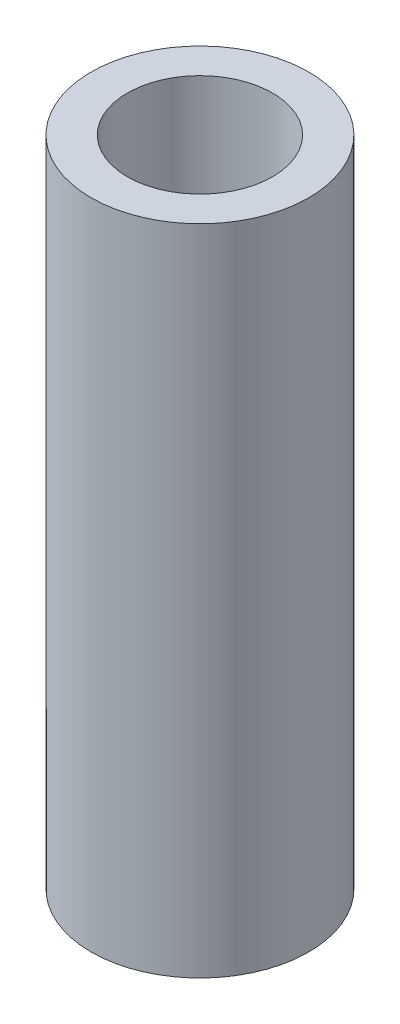
ISO-10303-21;
HEADER;
FILE_DESCRIPTION(('STEP AP214'),'2;1');
FILE_NAME('part.step','',(''),(''),'','','');
FILE_SCHEMA(('AUTOMOTIVE_DESIGN { 1 0 10303 214 1 1 1 1 }'));
ENDSEC;
DATA;
#1=APPLICATION_CONTEXT('core data for automotive mechanical design processes');
#2=APPLICATION_PROTOCOL_DEFINITION('international standard','automotive_design',2000,#1);
#3=PRODUCT_CONTEXT('',#1,'mechanical');
#4=PRODUCT('Part','Part','',(#3));
#5=PRODUCT_RELATED_PRODUCT_CATEGORY('part','',(#4));
#6=PRODUCT_DEFINITION_FORMATION('','',#4);
#7=PRODUCT_DEFINITION_CONTEXT('part definition',#1,'design');
#8=PRODUCT_DEFINITION('design','',#6,#7);
#9=PRODUCT_DEFINITION_SHAPE('','',#8);
#10=(LENGTH_UNIT() NAMED_UNIT(*) SI_UNIT(.MILLI.,.METRE.));
#11=(NAMED_UNIT(*) PLANE_ANGLE_UNIT() SI_UNIT($,.RADIAN.));
#12=(NAMED_UNIT(*) SI_UNIT($,.STERADIAN.) SOLID_ANGLE_UNIT());
#13=UNCERTAINTY_MEASURE_WITH_UNIT(LENGTH_MEASURE(1.E-05),#10,'distance_accuracy_value','');
#14=(GEOMETRIC_REPRESENTATION_CONTEXT(3) GLOBAL_UNCERTAINTY_ASSIGNED_CONTEXT((#13)) GLOBAL_UNIT_ASSIGNED_CONTEXT((#10,
#11,#12)) REPRESENTATION_CONTEXT('',''));
#15=CARTESIAN_POINT('',(0.,0.,0.));
#16=DIRECTION('',(0.,0.,1.));
#17=DIRECTION('',(1.,0.,0.));
#18=AXIS2_PLACEMENT_3D('',#15,#16,#17);
#19=CARTESIAN_POINT('',(0.,18.,0.));
#20=DIRECTION('',(0.,-1.,0.));
#21=DIRECTION('',(0.,0.,-1.));
#22=AXIS2_PLACEMENT_3D('',#19,#20,#21);
#23=CYLINDRICAL_SURFACE('',#22,3.);
#24=CARTESIAN_POINT('',(0.,18.,0.));
#25=DIRECTION('',(0.,1.,0.));
#26=DIRECTION('',(0.,0.,1.));
#27=AXIS2_PLACEMENT_3D('',#24,#25,#26);
#28=CIRCLE('',#27,3.);
#29=CARTESIAN_POINT('',(0.,18.,3.));
#30=VERTEX_POINT('',#29);
#31=EDGE_CURVE('E10',#30,#30,#28,.T.);
#32=ORIENTED_EDGE('',*,*,#31,.F.);
#33=EDGE_LOOP('',(#32));
#34=FACE_BOUND('',#33,.T.);
#35=CARTESIAN_POINT('',(0.,0.,0.));
#36=DIRECTION('',(0.,1.,0.));
#37=DIRECTION('',(0.,0.,1.));
#38=AXIS2_PLACEMENT_3D('',#35,#36,#37);
#39=CIRCLE('',#38,3.);
#40=CARTESIAN_POINT('',(0.,0.,3.));
#41=VERTEX_POINT('',#40);
#42=EDGE_CURVE('E46',#41,#41,#39,.T.);
#43=ORIENTED_EDGE('',*,*,#42,.T.);
#44=EDGE_LOOP('',(#43));
#45=FACE_BOUND('',#44,.T.);
#46=ADVANCED_FACE('F43',(#34,#45),#23,.T.);
#47=CARTESIAN_POINT('',(0.,18.,0.));
#48=DIRECTION('',(0.,1.,0.));
#49=DIRECTION('',(0.,0.,1.));
#50=AXIS2_PLACEMENT_3D('',#47,#48,#49);
#51=PLANE('',#50);
#52=CARTESIAN_POINT('',(0.,18.,0.));
#53=DIRECTION('',(0.,1.,0.));
#54=DIRECTION('',(0.,0.,1.));
#55=AXIS2_PLACEMENT_3D('',#52,#53,#54);
#56=CIRCLE('',#55,2.);
#57=CARTESIAN_POINT('',(0.,18.,2.));
#58=VERTEX_POINT('',#57);
#59=EDGE_CURVE('E57',#58,#58,#56,.T.);
#60=ORIENTED_EDGE('',*,*,#59,.F.);
#61=EDGE_LOOP('',(#60));
#62=FACE_BOUND('',#61,.T.);
#63=ORIENTED_EDGE('',*,*,#31,.T.);
#64=EDGE_LOOP('',(#63));
#65=FACE_BOUND('',#64,.T.);
#66=ADVANCED_FACE('F74',(#62,#65),#51,.T.);
#67=CARTESIAN_POINT('',(0.,0.,0.));
#68=DIRECTION('',(0.,1.,0.));
#69=DIRECTION('',(0.,0.,1.));
#70=AXIS2_PLACEMENT_3D('',#67,#68,#69);
#71=PLANE('',#70);
#72=CARTESIAN_POINT('',(0.,0.,0.));
#73=DIRECTION('',(0.,1.,0.));
#74=DIRECTION('',(0.,0.,1.));
#75=AXIS2_PLACEMENT_3D('',#72,#73,#74);
#76=CIRCLE('',#75,2.);
#77=CARTESIAN_POINT('',(0.,0.,2.));
#78=VERTEX_POINT('',#77);
#79=EDGE_CURVE('E55',#78,#78,#76,.T.);
#80=ORIENTED_EDGE('',*,*,#79,.T.);
#81=EDGE_LOOP('',(#80));
#82=FACE_BOUND('',#81,.T.);
#83=ORIENTED_EDGE('',*,*,#42,.F.);
#84=EDGE_LOOP('',(#83));
#85=FACE_BOUND('',#84,.T.);
#86=ADVANCED_FACE('F65',(#82,#85),#71,.F.);
#87=CARTESIAN_POINT('',(0.,0.,0.));
#88=DIRECTION('',(0.,1.,0.));
#89=DIRECTION('',(0.,0.,1.));
#90=AXIS2_PLACEMENT_3D('',#87,#88,#89);
#91=CYLINDRICAL_SURFACE('',#90,2.);
#92=ORIENTED_EDGE('',*,*,#79,.F.);
#93=EDGE_LOOP('',(#92));
#94=FACE_BOUND('',#93,.T.);
#95=ORIENTED_EDGE('',*,*,#59,.T.);
#96=EDGE_LOOP('',(#95));
#97=FACE_BOUND('',#96,.T.);
#98=ADVANCED_FACE('F68',(#94,#97),#91,.F.);
#99=CLOSED_SHELL('',(#46,#66,#86,#98));
#100=MANIFOLD_SOLID_BREP('B2',#99);
#101=ADVANCED_BREP_SHAPE_REPRESENTATION('',(#18,#100),#14);
#102=SHAPE_DEFINITION_REPRESENTATION(#9,#101);
ENDSEC;
END-ISO-10303-21;
